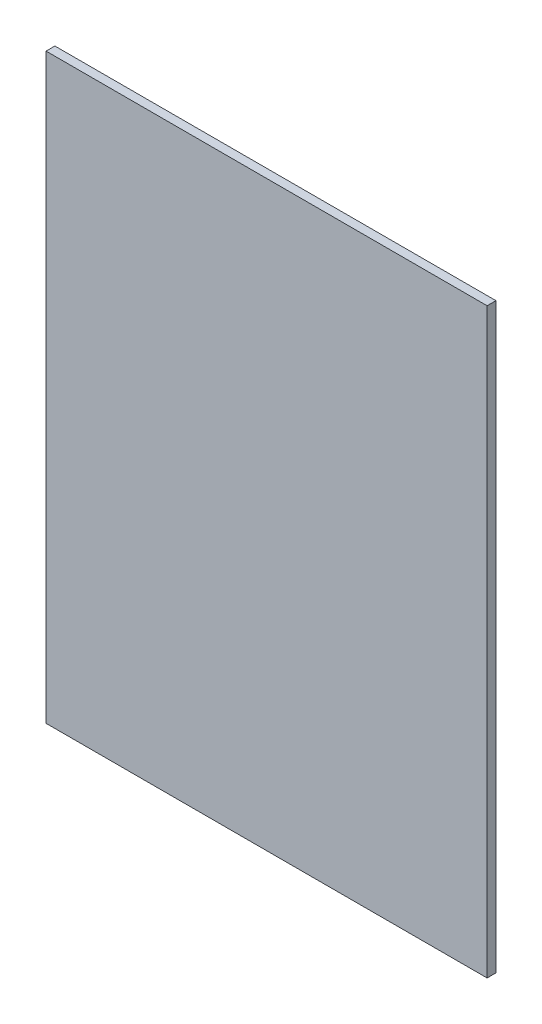
ISO-10303-21;
HEADER;
FILE_DESCRIPTION(('STEP AP214'),'2;1');
FILE_NAME('part.step','',(''),(''),'','','');
FILE_SCHEMA(('AUTOMOTIVE_DESIGN { 1 0 10303 214 1 1 1 1 }'));
ENDSEC;
DATA;
#1=APPLICATION_CONTEXT('core data for automotive mechanical design processes');
#2=APPLICATION_PROTOCOL_DEFINITION('international standard','automotive_design',2000,#1);
#3=PRODUCT_CONTEXT('',#1,'mechanical');
#4=PRODUCT('Part','Part','',(#3));
#5=PRODUCT_RELATED_PRODUCT_CATEGORY('part','',(#4));
#6=PRODUCT_DEFINITION_FORMATION('','',#4);
#7=PRODUCT_DEFINITION_CONTEXT('part definition',#1,'design');
#8=PRODUCT_DEFINITION('design','',#6,#7);
#9=PRODUCT_DEFINITION_SHAPE('','',#8);
#10=(LENGTH_UNIT() NAMED_UNIT(*) SI_UNIT(.MILLI.,.METRE.));
#11=(NAMED_UNIT(*) PLANE_ANGLE_UNIT() SI_UNIT($,.RADIAN.));
#12=(NAMED_UNIT(*) SI_UNIT($,.STERADIAN.) SOLID_ANGLE_UNIT());
#13=UNCERTAINTY_MEASURE_WITH_UNIT(LENGTH_MEASURE(1.E-05),#10,'distance_accuracy_value','');
#14=(GEOMETRIC_REPRESENTATION_CONTEXT(3) GLOBAL_UNCERTAINTY_ASSIGNED_CONTEXT((#13)) GLOBAL_UNIT_ASSIGNED_CONTEXT((#10,
#11,#12)) REPRESENTATION_CONTEXT('',''));
#15=CARTESIAN_POINT('',(0.,0.,0.));
#16=DIRECTION('',(0.,0.,1.));
#17=DIRECTION('',(1.,0.,0.));
#18=AXIS2_PLACEMENT_3D('',#15,#16,#17);
#19=CARTESIAN_POINT('',(-31.3693693693694,26.1591591591592,1.));
#20=DIRECTION('',(1.,0.,0.));
#21=DIRECTION('',(0.,1.,0.));
#22=AXIS2_PLACEMENT_3D('',#19,#20,#21);
#23=PLANE('',#22);
#24=DIRECTION('',(0.,-1.,0.));
#25=VECTOR('',#24,1.);
#26=CARTESIAN_POINT('',(-31.3693693693694,26.1591591591592,0.));
#27=LINE('',#26,#25);
#28=CARTESIAN_POINT('',(-31.3693693693694,26.1591591591592,0.));
#29=VERTEX_POINT('',#28);
#30=CARTESIAN_POINT('',(-31.3693693693694,-39.8408408408408,0.));
#31=VERTEX_POINT('',#30);
#32=EDGE_CURVE('E111',#29,#31,#27,.T.);
#33=ORIENTED_EDGE('',*,*,#32,.T.);
#34=DIRECTION('',(0.,0.,-1.));
#35=VECTOR('',#34,1.);
#36=CARTESIAN_POINT('',(-31.3693693693694,-39.8408408408408,1.));
#37=LINE('',#36,#35);
#38=CARTESIAN_POINT('',(-31.3693693693694,-39.8408408408408,1.));
#39=VERTEX_POINT('',#38);
#40=EDGE_CURVE('E11',#39,#31,#37,.T.);
#41=ORIENTED_EDGE('',*,*,#40,.F.);
#42=DIRECTION('',(0.,-1.,0.));
#43=VECTOR('',#42,1.);
#44=CARTESIAN_POINT('',(-31.3693693693694,26.1591591591592,1.));
#45=LINE('',#44,#43);
#46=CARTESIAN_POINT('',(-31.3693693693694,26.1591591591592,1.));
#47=VERTEX_POINT('',#46);
#48=EDGE_CURVE('E95',#47,#39,#45,.T.);
#49=ORIENTED_EDGE('',*,*,#48,.F.);
#50=DIRECTION('',(0.,0.,-1.));
#51=VECTOR('',#50,1.);
#52=CARTESIAN_POINT('',(-31.3693693693694,26.1591591591592,1.));
#53=LINE('',#52,#51);
#54=EDGE_CURVE('E107',#47,#29,#53,.T.);
#55=ORIENTED_EDGE('',*,*,#54,.T.);
#56=EDGE_LOOP('',(#33,#41,#49,#55));
#57=FACE_BOUND('',#56,.T.);
#58=ADVANCED_FACE('F43',(#57),#23,.F.);
#59=CARTESIAN_POINT('',(-31.3693693693694,-39.8408408408408,1.));
#60=DIRECTION('',(0.,1.,0.));
#61=DIRECTION('',(0.,0.,1.));
#62=AXIS2_PLACEMENT_3D('',#59,#60,#61);
#63=PLANE('',#62);
#64=DIRECTION('',(1.,0.,0.));
#65=VECTOR('',#64,1.);
#66=CARTESIAN_POINT('',(-31.3693693693694,-39.8408408408408,0.));
#67=LINE('',#66,#65);
#68=CARTESIAN_POINT('',(18.6306306306306,-39.8408408408408,0.));
#69=VERTEX_POINT('',#68);
#70=EDGE_CURVE('E100',#31,#69,#67,.T.);
#71=ORIENTED_EDGE('',*,*,#70,.T.);
#72=DIRECTION('',(0.,0.,-1.));
#73=VECTOR('',#72,1.);
#74=CARTESIAN_POINT('',(18.6306306306306,-39.8408408408408,1.));
#75=LINE('',#74,#73);
#76=CARTESIAN_POINT('',(18.6306306306306,-39.8408408408408,1.));
#77=VERTEX_POINT('',#76);
#78=EDGE_CURVE('E52',#77,#69,#75,.T.);
#79=ORIENTED_EDGE('',*,*,#78,.F.);
#80=DIRECTION('',(1.,0.,0.));
#81=VECTOR('',#80,1.);
#82=CARTESIAN_POINT('',(-31.3693693693694,-39.8408408408408,1.));
#83=LINE('',#82,#81);
#84=EDGE_CURVE('E90',#39,#77,#83,.T.);
#85=ORIENTED_EDGE('',*,*,#84,.F.);
#86=ORIENTED_EDGE('',*,*,#40,.T.);
#87=EDGE_LOOP('',(#71,#79,#85,#86));
#88=FACE_BOUND('',#87,.T.);
#89=ADVANCED_FACE('F99',(#88),#63,.F.);
#90=CARTESIAN_POINT('',(18.6306306306306,26.1591591591592,1.));
#91=DIRECTION('',(-1.,0.,0.));
#92=DIRECTION('',(0.,-1.,0.));
#93=AXIS2_PLACEMENT_3D('',#90,#91,#92);
#94=PLANE('',#93);
#95=DIRECTION('',(0.,1.,0.));
#96=VECTOR('',#95,1.);
#97=CARTESIAN_POINT('',(18.6306306306306,26.1591591591592,0.));
#98=LINE('',#97,#96);
#99=CARTESIAN_POINT('',(18.6306306306306,26.1591591591592,0.));
#100=VERTEX_POINT('',#99);
#101=EDGE_CURVE('E77',#69,#100,#98,.T.);
#102=ORIENTED_EDGE('',*,*,#101,.T.);
#103=DIRECTION('',(0.,0.,-1.));
#104=VECTOR('',#103,1.);
#105=CARTESIAN_POINT('',(18.6306306306306,26.1591591591592,1.));
#106=LINE('',#105,#104);
#107=CARTESIAN_POINT('',(18.6306306306306,26.1591591591592,1.));
#108=VERTEX_POINT('',#107);
#109=EDGE_CURVE('E102',#108,#100,#106,.T.);
#110=ORIENTED_EDGE('',*,*,#109,.F.);
#111=DIRECTION('',(0.,1.,0.));
#112=VECTOR('',#111,1.);
#113=CARTESIAN_POINT('',(18.6306306306306,26.1591591591592,1.));
#114=LINE('',#113,#112);
#115=EDGE_CURVE('E93',#77,#108,#114,.T.);
#116=ORIENTED_EDGE('',*,*,#115,.F.);
#117=ORIENTED_EDGE('',*,*,#78,.T.);
#118=EDGE_LOOP('',(#102,#110,#116,#117));
#119=FACE_BOUND('',#118,.T.);
#120=ADVANCED_FACE('F103',(#119),#94,.F.);
#121=CARTESIAN_POINT('',(-31.3693693693694,26.1591591591592,1.));
#122=DIRECTION('',(0.,-1.,0.));
#123=DIRECTION('',(0.,0.,-1.));
#124=AXIS2_PLACEMENT_3D('',#121,#122,#123);
#125=PLANE('',#124);
#126=DIRECTION('',(-1.,0.,0.));
#127=VECTOR('',#126,1.);
#128=CARTESIAN_POINT('',(-31.3693693693694,26.1591591591592,0.));
#129=LINE('',#128,#127);
#130=EDGE_CURVE('E83',#100,#29,#129,.T.);
#131=ORIENTED_EDGE('',*,*,#130,.T.);
#132=ORIENTED_EDGE('',*,*,#54,.F.);
#133=DIRECTION('',(-1.,0.,0.));
#134=VECTOR('',#133,1.);
#135=CARTESIAN_POINT('',(-31.3693693693694,26.1591591591592,1.));
#136=LINE('',#135,#134);
#137=EDGE_CURVE('E60',#108,#47,#136,.T.);
#138=ORIENTED_EDGE('',*,*,#137,.F.);
#139=ORIENTED_EDGE('',*,*,#109,.T.);
#140=EDGE_LOOP('',(#131,#132,#138,#139));
#141=FACE_BOUND('',#140,.T.);
#142=ADVANCED_FACE('F124',(#141),#125,.F.);
#143=CARTESIAN_POINT('',(0.,0.,1.));
#144=DIRECTION('',(0.,0.,1.));
#145=DIRECTION('',(1.,0.,0.));
#146=AXIS2_PLACEMENT_3D('',#143,#144,#145);
#147=PLANE('',#146);
#148=ORIENTED_EDGE('',*,*,#48,.T.);
#149=ORIENTED_EDGE('',*,*,#84,.T.);
#150=ORIENTED_EDGE('',*,*,#115,.T.);
#151=ORIENTED_EDGE('',*,*,#137,.T.);
#152=EDGE_LOOP('',(#148,#149,#150,#151));
#153=FACE_BOUND('',#152,.T.);
#154=ADVANCED_FACE('F91',(#153),#147,.T.);
#155=CARTESIAN_POINT('',(0.,0.,0.));
#156=DIRECTION('',(0.,0.,1.));
#157=DIRECTION('',(1.,0.,0.));
#158=AXIS2_PLACEMENT_3D('',#155,#156,#157);
#159=PLANE('',#158);
#160=ORIENTED_EDGE('',*,*,#32,.F.);
#161=ORIENTED_EDGE('',*,*,#130,.F.);
#162=ORIENTED_EDGE('',*,*,#101,.F.);
#163=ORIENTED_EDGE('',*,*,#70,.F.);
#164=EDGE_LOOP('',(#160,#161,#162,#163));
#165=FACE_BOUND('',#164,.T.);
#166=ADVANCED_FACE('F127',(#165),#159,.F.);
#167=CLOSED_SHELL('',(#58,#89,#120,#142,#154,#166));
#168=MANIFOLD_SOLID_BREP('B2',#167);
#169=ADVANCED_BREP_SHAPE_REPRESENTATION('',(#18,#168),#14);
#170=SHAPE_DEFINITION_REPRESENTATION(#9,#169);
ENDSEC;
END-ISO-10303-21;
